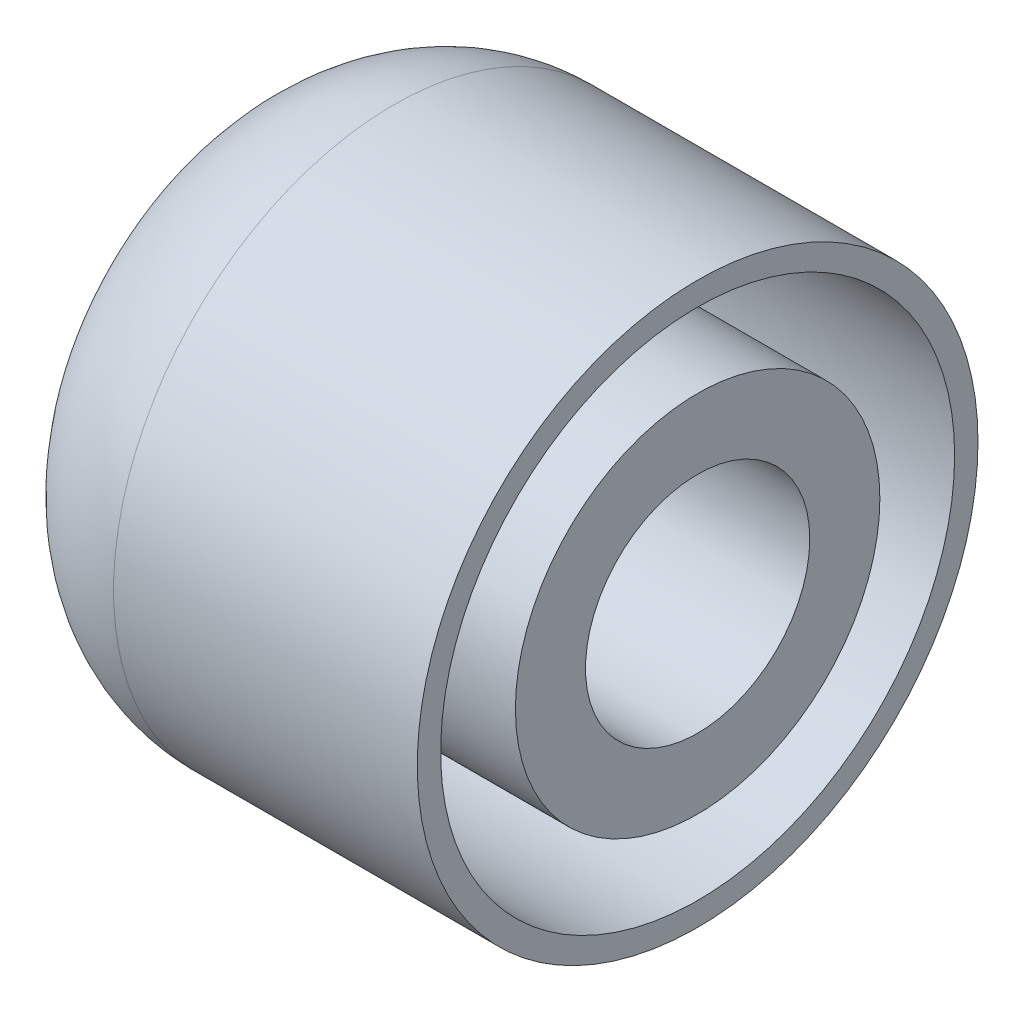
ISO-10303-21;
HEADER;
FILE_DESCRIPTION(('STEP AP214'),'2;1');
FILE_NAME('part.step','',(''),(''),'','','');
FILE_SCHEMA(('AUTOMOTIVE_DESIGN { 1 0 10303 214 1 1 1 1 }'));
ENDSEC;
DATA;
#1=APPLICATION_CONTEXT('core data for automotive mechanical design processes');
#2=APPLICATION_PROTOCOL_DEFINITION('international standard','automotive_design',2000,#1);
#3=PRODUCT_CONTEXT('',#1,'mechanical');
#4=PRODUCT('Part','Part','',(#3));
#5=PRODUCT_RELATED_PRODUCT_CATEGORY('part','',(#4));
#6=PRODUCT_DEFINITION_FORMATION('','',#4);
#7=PRODUCT_DEFINITION_CONTEXT('part definition',#1,'design');
#8=PRODUCT_DEFINITION('design','',#6,#7);
#9=PRODUCT_DEFINITION_SHAPE('','',#8);
#10=(LENGTH_UNIT() NAMED_UNIT(*) SI_UNIT(.MILLI.,.METRE.));
#11=(NAMED_UNIT(*) PLANE_ANGLE_UNIT() SI_UNIT($,.RADIAN.));
#12=(NAMED_UNIT(*) SI_UNIT($,.STERADIAN.) SOLID_ANGLE_UNIT());
#13=UNCERTAINTY_MEASURE_WITH_UNIT(LENGTH_MEASURE(1.E-05),#10,'distance_accuracy_value','');
#14=(GEOMETRIC_REPRESENTATION_CONTEXT(3) GLOBAL_UNCERTAINTY_ASSIGNED_CONTEXT((#13)) GLOBAL_UNIT_ASSIGNED_CONTEXT((#10,
#11,#12)) REPRESENTATION_CONTEXT('',''));
#15=CARTESIAN_POINT('',(0.,0.,0.));
#16=DIRECTION('',(0.,0.,1.));
#17=DIRECTION('',(1.,0.,0.));
#18=AXIS2_PLACEMENT_3D('',#15,#16,#17);
#19=CARTESIAN_POINT('',(0.,0.,0.));
#20=DIRECTION('',(1.,0.,0.));
#21=DIRECTION('',(0.,0.,-1.));
#22=AXIS2_PLACEMENT_3D('',#19,#20,#21);
#23=CYLINDRICAL_SURFACE('',#22,5.5);
#24=CARTESIAN_POINT('',(0.,0.,0.));
#25=DIRECTION('',(1.,0.,0.));
#26=DIRECTION('',(0.,0.,-1.));
#27=AXIS2_PLACEMENT_3D('',#24,#25,#26);
#28=CIRCLE('',#27,5.5);
#29=CARTESIAN_POINT('',(0.,0.,-5.5));
#30=VERTEX_POINT('',#29);
#31=EDGE_CURVE('E10',#30,#30,#28,.T.);
#32=ORIENTED_EDGE('',*,*,#31,.T.);
#33=EDGE_LOOP('',(#32));
#34=FACE_BOUND('',#33,.T.);
#35=CARTESIAN_POINT('',(-6.,0.,0.));
#36=DIRECTION('',(1.,0.,0.));
#37=DIRECTION('',(0.,0.,-1.));
#38=AXIS2_PLACEMENT_3D('',#35,#36,#37);
#39=CIRCLE('',#38,5.5);
#40=CARTESIAN_POINT('',(-6.,0.,-5.5));
#41=VERTEX_POINT('',#40);
#42=EDGE_CURVE('E90',#41,#41,#39,.T.);
#43=ORIENTED_EDGE('',*,*,#42,.F.);
#44=EDGE_LOOP('',(#43));
#45=FACE_BOUND('',#44,.T.);
#46=ADVANCED_FACE('F51',(#34,#45),#23,.F.);
#47=CARTESIAN_POINT('',(0.,5.5,0.));
#48=DIRECTION('',(1.,0.,0.));
#49=DIRECTION('',(0.,0.,-1.));
#50=AXIS2_PLACEMENT_3D('',#47,#48,#49);
#51=PLANE('',#50);
#52=CARTESIAN_POINT('',(0.,0.,0.));
#53=DIRECTION('',(1.,0.,0.));
#54=DIRECTION('',(0.,0.,-1.));
#55=AXIS2_PLACEMENT_3D('',#52,#53,#54);
#56=CIRCLE('',#55,6.);
#57=CARTESIAN_POINT('',(0.,0.,-6.));
#58=VERTEX_POINT('',#57);
#59=EDGE_CURVE('E58',#58,#58,#56,.T.);
#60=ORIENTED_EDGE('',*,*,#59,.T.);
#61=EDGE_LOOP('',(#60));
#62=FACE_BOUND('',#61,.T.);
#63=ORIENTED_EDGE('',*,*,#31,.F.);
#64=EDGE_LOOP('',(#63));
#65=FACE_BOUND('',#64,.T.);
#66=ADVANCED_FACE('F99',(#62,#65),#51,.T.);
#67=CARTESIAN_POINT('',(0.,0.,0.));
#68=DIRECTION('',(1.,0.,0.));
#69=DIRECTION('',(0.,0.,-1.));
#70=AXIS2_PLACEMENT_3D('',#67,#68,#69);
#71=CYLINDRICAL_SURFACE('',#70,6.);
#72=CARTESIAN_POINT('',(-6.49999999999998,0.,0.));
#73=DIRECTION('',(1.,0.,0.));
#74=DIRECTION('',(0.,0.,-1.));
#75=AXIS2_PLACEMENT_3D('',#72,#73,#74);
#76=CIRCLE('',#75,6.);
#77=CARTESIAN_POINT('',(-6.49999999999998,0.,-6.));
#78=VERTEX_POINT('',#77);
#79=EDGE_CURVE('E63',#78,#78,#76,.T.);
#80=ORIENTED_EDGE('',*,*,#79,.T.);
#81=EDGE_LOOP('',(#80));
#82=FACE_BOUND('',#81,.T.);
#83=ORIENTED_EDGE('',*,*,#59,.F.);
#84=EDGE_LOOP('',(#83));
#85=FACE_BOUND('',#84,.T.);
#86=ADVANCED_FACE('F103',(#82,#85),#71,.T.);
#87=CARTESIAN_POINT('',(-6.5,0.,0.));
#88=DIRECTION('',(1.,0.,0.));
#89=DIRECTION('',(0.,0.,-1.));
#90=AXIS2_PLACEMENT_3D('',#87,#88,#89);
#91=DEGENERATE_TOROIDAL_SURFACE('',#90,2.5,3.5,.T.);
#92=CARTESIAN_POINT('',(-10.,0.,0.));
#93=DIRECTION('',(1.,0.,0.));
#94=DIRECTION('',(0.,0.,-1.));
#95=AXIS2_PLACEMENT_3D('',#92,#93,#94);
#96=CIRCLE('',#95,2.49999999999998);
#97=CARTESIAN_POINT('',(-10.,0.,-2.49999999999998));
#98=VERTEX_POINT('',#97);
#99=EDGE_CURVE('E68',#98,#98,#96,.T.);
#100=ORIENTED_EDGE('',*,*,#99,.T.);
#101=EDGE_LOOP('',(#100));
#102=FACE_BOUND('',#101,.T.);
#103=ORIENTED_EDGE('',*,*,#79,.F.);
#104=EDGE_LOOP('',(#103));
#105=FACE_BOUND('',#104,.T.);
#106=ADVANCED_FACE('F107',(#102,#105),#91,.T.);
#107=CARTESIAN_POINT('',(-10.,2.49999999999997,0.));
#108=DIRECTION('',(-1.,0.,0.));
#109=DIRECTION('',(0.,0.,1.));
#110=AXIS2_PLACEMENT_3D('',#107,#108,#109);
#111=PLANE('',#110);
#112=CARTESIAN_POINT('',(-10.,0.,0.));
#113=DIRECTION('',(1.,0.,0.));
#114=DIRECTION('',(0.,0.,-1.));
#115=AXIS2_PLACEMENT_3D('',#112,#113,#114);
#116=CIRCLE('',#115,2.4);
#117=CARTESIAN_POINT('',(-10.,0.,-2.4));
#118=VERTEX_POINT('',#117);
#119=EDGE_CURVE('E74',#118,#118,#116,.T.);
#120=ORIENTED_EDGE('',*,*,#119,.T.);
#121=EDGE_LOOP('',(#120));
#122=FACE_BOUND('',#121,.T.);
#123=ORIENTED_EDGE('',*,*,#99,.F.);
#124=EDGE_LOOP('',(#123));
#125=FACE_BOUND('',#124,.T.);
#126=ADVANCED_FACE('F114',(#122,#125),#111,.T.);
#127=CARTESIAN_POINT('',(0.,0.,0.));
#128=DIRECTION('',(1.,0.,0.));
#129=DIRECTION('',(0.,0.,-1.));
#130=AXIS2_PLACEMENT_3D('',#127,#128,#129);
#131=CYLINDRICAL_SURFACE('',#130,2.4);
#132=CARTESIAN_POINT('',(0.,0.,0.));
#133=DIRECTION('',(1.,0.,0.));
#134=DIRECTION('',(0.,0.,-1.));
#135=AXIS2_PLACEMENT_3D('',#132,#133,#134);
#136=CIRCLE('',#135,2.4);
#137=CARTESIAN_POINT('',(0.,0.,-2.4));
#138=VERTEX_POINT('',#137);
#139=EDGE_CURVE('E78',#138,#138,#136,.T.);
#140=ORIENTED_EDGE('',*,*,#139,.T.);
#141=EDGE_LOOP('',(#140));
#142=FACE_BOUND('',#141,.T.);
#143=ORIENTED_EDGE('',*,*,#119,.F.);
#144=EDGE_LOOP('',(#143));
#145=FACE_BOUND('',#144,.T.);
#146=ADVANCED_FACE('F118',(#142,#145),#131,.F.);
#147=CARTESIAN_POINT('',(0.,2.4,0.));
#148=DIRECTION('',(1.,0.,0.));
#149=DIRECTION('',(0.,0.,-1.));
#150=AXIS2_PLACEMENT_3D('',#147,#148,#149);
#151=PLANE('',#150);
#152=CARTESIAN_POINT('',(0.,0.,0.));
#153=DIRECTION('',(1.,0.,0.));
#154=DIRECTION('',(0.,0.,-1.));
#155=AXIS2_PLACEMENT_3D('',#152,#153,#154);
#156=CIRCLE('',#155,3.9);
#157=CARTESIAN_POINT('',(0.,0.,-3.9));
#158=VERTEX_POINT('',#157);
#159=EDGE_CURVE('E82',#158,#158,#156,.T.);
#160=ORIENTED_EDGE('',*,*,#159,.T.);
#161=EDGE_LOOP('',(#160));
#162=FACE_BOUND('',#161,.T.);
#163=ORIENTED_EDGE('',*,*,#139,.F.);
#164=EDGE_LOOP('',(#163));
#165=FACE_BOUND('',#164,.T.);
#166=ADVANCED_FACE('F122',(#162,#165),#151,.T.);
#167=CARTESIAN_POINT('',(0.,0.,0.));
#168=DIRECTION('',(1.,0.,0.));
#169=DIRECTION('',(0.,0.,-1.));
#170=AXIS2_PLACEMENT_3D('',#167,#168,#169);
#171=CYLINDRICAL_SURFACE('',#170,3.9);
#172=CARTESIAN_POINT('',(-6.,0.,0.));
#173=DIRECTION('',(1.,0.,0.));
#174=DIRECTION('',(0.,0.,-1.));
#175=AXIS2_PLACEMENT_3D('',#172,#173,#174);
#176=CIRCLE('',#175,3.9);
#177=CARTESIAN_POINT('',(-6.,0.,-3.9));
#178=VERTEX_POINT('',#177);
#179=EDGE_CURVE('E86',#178,#178,#176,.T.);
#180=ORIENTED_EDGE('',*,*,#179,.T.);
#181=EDGE_LOOP('',(#180));
#182=FACE_BOUND('',#181,.T.);
#183=ORIENTED_EDGE('',*,*,#159,.F.);
#184=EDGE_LOOP('',(#183));
#185=FACE_BOUND('',#184,.T.);
#186=ADVANCED_FACE('F126',(#182,#185),#171,.T.);
#187=CARTESIAN_POINT('',(-6.,3.9,0.));
#188=DIRECTION('',(1.,0.,0.));
#189=DIRECTION('',(0.,0.,-1.));
#190=AXIS2_PLACEMENT_3D('',#187,#188,#189);
#191=PLANE('',#190);
#192=ORIENTED_EDGE('',*,*,#42,.T.);
#193=EDGE_LOOP('',(#192));
#194=FACE_BOUND('',#193,.T.);
#195=ORIENTED_EDGE('',*,*,#179,.F.);
#196=EDGE_LOOP('',(#195));
#197=FACE_BOUND('',#196,.T.);
#198=ADVANCED_FACE('F95',(#194,#197),#191,.T.);
#199=CLOSED_SHELL('',(#46,#66,#86,#106,#126,#146,#166,#186,#198));
#200=MANIFOLD_SOLID_BREP('B2',#199);
#201=ADVANCED_BREP_SHAPE_REPRESENTATION('',(#18,#200),#14);
#202=SHAPE_DEFINITION_REPRESENTATION(#9,#201);
ENDSEC;
END-ISO-10303-21;
